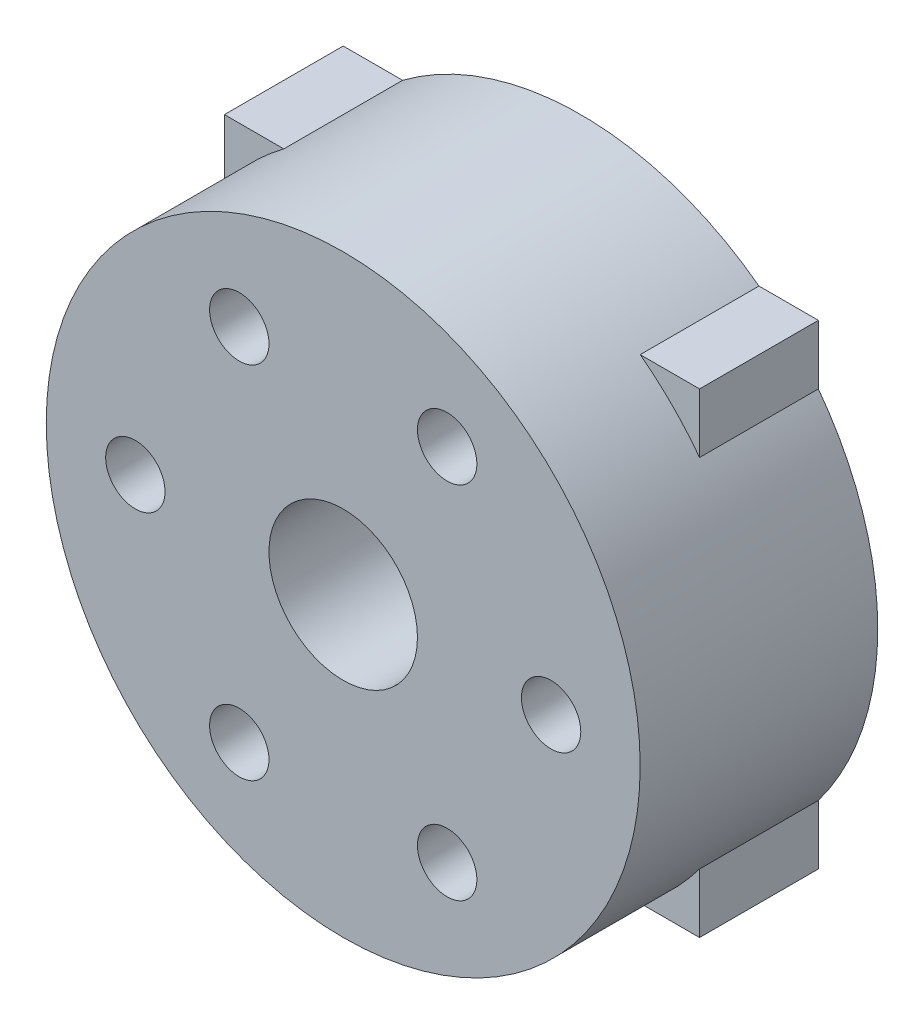
ISO-10303-21;
HEADER;
FILE_DESCRIPTION(('STEP AP214'),'2;1');
FILE_NAME('part.step','',(''),(''),'','','');
FILE_SCHEMA(('AUTOMOTIVE_DESIGN { 1 0 10303 214 1 1 1 1 }'));
ENDSEC;
DATA;
#1=APPLICATION_CONTEXT('core data for automotive mechanical design processes');
#2=APPLICATION_PROTOCOL_DEFINITION('international standard','automotive_design',2000,#1);
#3=PRODUCT_CONTEXT('',#1,'mechanical');
#4=PRODUCT('Part','Part','',(#3));
#5=PRODUCT_RELATED_PRODUCT_CATEGORY('part','',(#4));
#6=PRODUCT_DEFINITION_FORMATION('','',#4);
#7=PRODUCT_DEFINITION_CONTEXT('part definition',#1,'design');
#8=PRODUCT_DEFINITION('design','',#6,#7);
#9=PRODUCT_DEFINITION_SHAPE('','',#8);
#10=(LENGTH_UNIT() NAMED_UNIT(*) SI_UNIT(.MILLI.,.METRE.));
#11=(NAMED_UNIT(*) PLANE_ANGLE_UNIT() SI_UNIT($,.RADIAN.));
#12=(NAMED_UNIT(*) SI_UNIT($,.STERADIAN.) SOLID_ANGLE_UNIT());
#13=UNCERTAINTY_MEASURE_WITH_UNIT(LENGTH_MEASURE(1.E-05),#10,'distance_accuracy_value','');
#14=(GEOMETRIC_REPRESENTATION_CONTEXT(3) GLOBAL_UNCERTAINTY_ASSIGNED_CONTEXT((#13)) GLOBAL_UNIT_ASSIGNED_CONTEXT((#10,
#11,#12)) REPRESENTATION_CONTEXT('',''));
#15=CARTESIAN_POINT('',(0.,0.,0.));
#16=DIRECTION('',(0.,0.,1.));
#17=DIRECTION('',(1.,0.,0.));
#18=AXIS2_PLACEMENT_3D('',#15,#16,#17);
#19=CARTESIAN_POINT('',(0.,0.,20.));
#20=DIRECTION('',(0.,0.,1.));
#21=DIRECTION('',(1.,0.,0.));
#22=AXIS2_PLACEMENT_3D('',#19,#20,#21);
#23=PLANE('',#22);
#24=CARTESIAN_POINT('',(17.5,30.310889132455,20.));
#25=DIRECTION('',(0.,0.,-1.));
#26=DIRECTION('',(0.50000000000019,0.866025403784329,0.));
#27=AXIS2_PLACEMENT_3D('',#24,#25,#26);
#28=CIRCLE('',#27,5.);
#29=CARTESIAN_POINT('',(20.,34.641016151378,20.));
#30=VERTEX_POINT('',#29);
#31=EDGE_CURVE('E25',#30,#30,#28,.T.);
#32=ORIENTED_EDGE('',*,*,#31,.F.);
#33=EDGE_LOOP('',(#32));
#34=FACE_BOUND('',#33,.T.);
#35=ADVANCED_FACE('F16',(#34),#23,.T.);
#36=CARTESIAN_POINT('',(0.,0.,20.));
#37=DIRECTION('',(0.,0.,1.));
#38=DIRECTION('',(1.,0.,0.));
#39=AXIS2_PLACEMENT_3D('',#36,#37,#38);
#40=PLANE('',#39);
#41=CARTESIAN_POINT('',(-17.5,30.310889132455,20.));
#42=DIRECTION('',(0.,0.,-1.));
#43=DIRECTION('',(-0.50000000000019,0.866025403784329,0.));
#44=AXIS2_PLACEMENT_3D('',#41,#42,#43);
#45=CIRCLE('',#44,5.);
#46=CARTESIAN_POINT('',(-20.,34.641016151378,20.));
#47=VERTEX_POINT('',#46);
#48=EDGE_CURVE('E120',#47,#47,#45,.T.);
#49=ORIENTED_EDGE('',*,*,#48,.F.);
#50=EDGE_LOOP('',(#49));
#51=FACE_BOUND('',#50,.T.);
#52=ADVANCED_FACE('F477',(#51),#40,.T.);
#53=CARTESIAN_POINT('',(0.,0.,20.));
#54=DIRECTION('',(0.,0.,1.));
#55=DIRECTION('',(1.,0.,0.));
#56=AXIS2_PLACEMENT_3D('',#53,#54,#55);
#57=PLANE('',#56);
#58=CARTESIAN_POINT('',(-35.,0.,20.));
#59=DIRECTION('',(0.,0.,-1.));
#60=DIRECTION('',(-1.,0.,0.));
#61=AXIS2_PLACEMENT_3D('',#58,#59,#60);
#62=CIRCLE('',#61,5.);
#63=CARTESIAN_POINT('',(-40.,0.,20.));
#64=VERTEX_POINT('',#63);
#65=EDGE_CURVE('E116',#64,#64,#62,.T.);
#66=ORIENTED_EDGE('',*,*,#65,.F.);
#67=EDGE_LOOP('',(#66));
#68=FACE_BOUND('',#67,.T.);
#69=ADVANCED_FACE('F482',(#68),#57,.T.);
#70=CARTESIAN_POINT('',(0.,0.,20.));
#71=DIRECTION('',(0.,0.,1.));
#72=DIRECTION('',(1.,0.,0.));
#73=AXIS2_PLACEMENT_3D('',#70,#71,#72);
#74=PLANE('',#73);
#75=CARTESIAN_POINT('',(35.,0.,20.));
#76=DIRECTION('',(0.,0.,-1.));
#77=DIRECTION('',(1.,0.,0.));
#78=AXIS2_PLACEMENT_3D('',#75,#76,#77);
#79=CIRCLE('',#78,5.);
#80=CARTESIAN_POINT('',(40.,0.,20.));
#81=VERTEX_POINT('',#80);
#82=EDGE_CURVE('E133',#81,#81,#79,.T.);
#83=ORIENTED_EDGE('',*,*,#82,.F.);
#84=EDGE_LOOP('',(#83));
#85=FACE_BOUND('',#84,.T.);
#86=ADVANCED_FACE('F504',(#85),#74,.T.);
#87=CARTESIAN_POINT('',(0.,0.,20.));
#88=DIRECTION('',(0.,0.,1.));
#89=DIRECTION('',(1.,0.,0.));
#90=AXIS2_PLACEMENT_3D('',#87,#88,#89);
#91=PLANE('',#90);
#92=CARTESIAN_POINT('',(0.,0.,20.));
#93=DIRECTION('',(0.,0.,-1.));
#94=DIRECTION('',(1.,0.,0.));
#95=AXIS2_PLACEMENT_3D('',#92,#93,#94);
#96=CIRCLE('',#95,12.5);
#97=CARTESIAN_POINT('',(12.5,0.,20.));
#98=VERTEX_POINT('',#97);
#99=EDGE_CURVE('E138',#98,#98,#96,.T.);
#100=ORIENTED_EDGE('',*,*,#99,.F.);
#101=EDGE_LOOP('',(#100));
#102=FACE_BOUND('',#101,.T.);
#103=ADVANCED_FACE('F501',(#102),#91,.T.);
#104=CARTESIAN_POINT('',(0.,0.,20.));
#105=DIRECTION('',(0.,0.,1.));
#106=DIRECTION('',(1.,0.,0.));
#107=AXIS2_PLACEMENT_3D('',#104,#105,#106);
#108=PLANE('',#107);
#109=CARTESIAN_POINT('',(17.5,-30.31088913245,20.));
#110=DIRECTION('',(0.,0.,-1.));
#111=DIRECTION('',(0.50000000000019,-0.866025403784329,0.));
#112=AXIS2_PLACEMENT_3D('',#109,#110,#111);
#113=CIRCLE('',#112,5.);
#114=CARTESIAN_POINT('',(20.,-34.64101615137,20.));
#115=VERTEX_POINT('',#114);
#116=EDGE_CURVE('E146',#115,#115,#113,.T.);
#117=ORIENTED_EDGE('',*,*,#116,.F.);
#118=EDGE_LOOP('',(#117));
#119=FACE_BOUND('',#118,.T.);
#120=ADVANCED_FACE('F496',(#119),#108,.T.);
#121=CARTESIAN_POINT('',(0.,0.,20.));
#122=DIRECTION('',(0.,0.,1.));
#123=DIRECTION('',(1.,0.,0.));
#124=AXIS2_PLACEMENT_3D('',#121,#122,#123);
#125=PLANE('',#124);
#126=CARTESIAN_POINT('',(-17.5,-30.31088913245,20.));
#127=DIRECTION('',(0.,0.,-1.));
#128=DIRECTION('',(-0.50000000000019,-0.866025403784329,0.));
#129=AXIS2_PLACEMENT_3D('',#126,#127,#128);
#130=CIRCLE('',#129,5.);
#131=CARTESIAN_POINT('',(-20.,-34.64101615137,20.));
#132=VERTEX_POINT('',#131);
#133=EDGE_CURVE('E147',#132,#132,#130,.T.);
#134=ORIENTED_EDGE('',*,*,#133,.F.);
#135=EDGE_LOOP('',(#134));
#136=FACE_BOUND('',#135,.T.);
#137=ADVANCED_FACE('F488',(#136),#125,.T.);
#138=CARTESIAN_POINT('',(17.5,30.310889132455,0.));
#139=DIRECTION('',(0.,0.,-1.));
#140=DIRECTION('',(0.50000000000019,0.866025403784329,0.));
#141=AXIS2_PLACEMENT_3D('',#138,#139,#140);
#142=CYLINDRICAL_SURFACE('',#141,5.);
#143=ORIENTED_EDGE('',*,*,#31,.T.);
#144=DIRECTION('',(0.,0.,1.));
#145=VECTOR('',#144,1.);
#146=CARTESIAN_POINT('',(20.,34.641016151378,0.));
#147=LINE('',#146,#145);
#148=CARTESIAN_POINT('',(20.,34.641016151378,40.));
#149=VERTEX_POINT('',#148);
#150=EDGE_CURVE('E10',#30,#149,#147,.T.);
#151=ORIENTED_EDGE('',*,*,#150,.T.);
#152=CARTESIAN_POINT('',(17.5,30.310889132455,40.));
#153=DIRECTION('',(0.,0.,-1.));
#154=DIRECTION('',(0.50000000000019,0.866025403784329,0.));
#155=AXIS2_PLACEMENT_3D('',#152,#153,#154);
#156=CIRCLE('',#155,5.);
#157=EDGE_CURVE('E152',#149,#149,#156,.T.);
#158=ORIENTED_EDGE('',*,*,#157,.F.);
#159=ORIENTED_EDGE('',*,*,#150,.F.);
#160=EDGE_LOOP('',(#143,#151,#158,#159));
#161=FACE_BOUND('',#160,.T.);
#162=ADVANCED_FACE('F485',(#161),#142,.F.);
#163=CARTESIAN_POINT('',(-17.5,30.310889132455,0.));
#164=DIRECTION('',(0.,0.,-1.));
#165=DIRECTION('',(-0.50000000000019,0.866025403784329,0.));
#166=AXIS2_PLACEMENT_3D('',#163,#164,#165);
#167=CYLINDRICAL_SURFACE('',#166,5.);
#168=ORIENTED_EDGE('',*,*,#48,.T.);
#169=DIRECTION('',(0.,0.,1.));
#170=VECTOR('',#169,1.);
#171=CARTESIAN_POINT('',(-20.,34.641016151378,0.));
#172=LINE('',#171,#170);
#173=CARTESIAN_POINT('',(-20.,34.641016151378,40.));
#174=VERTEX_POINT('',#173);
#175=EDGE_CURVE('E126',#47,#174,#172,.T.);
#176=ORIENTED_EDGE('',*,*,#175,.T.);
#177=CARTESIAN_POINT('',(-17.5,30.310889132455,40.));
#178=DIRECTION('',(0.,0.,-1.));
#179=DIRECTION('',(-0.50000000000019,0.866025403784329,0.));
#180=AXIS2_PLACEMENT_3D('',#177,#178,#179);
#181=CIRCLE('',#180,5.);
#182=EDGE_CURVE('E158',#174,#174,#181,.T.);
#183=ORIENTED_EDGE('',*,*,#182,.F.);
#184=ORIENTED_EDGE('',*,*,#175,.F.);
#185=EDGE_LOOP('',(#168,#176,#183,#184));
#186=FACE_BOUND('',#185,.T.);
#187=ADVANCED_FACE('F487',(#186),#167,.F.);
#188=CARTESIAN_POINT('',(-35.,0.,0.));
#189=DIRECTION('',(0.,0.,-1.));
#190=DIRECTION('',(-1.,0.,0.));
#191=AXIS2_PLACEMENT_3D('',#188,#189,#190);
#192=CYLINDRICAL_SURFACE('',#191,5.);
#193=ORIENTED_EDGE('',*,*,#65,.T.);
#194=DIRECTION('',(0.,0.,1.));
#195=VECTOR('',#194,1.);
#196=CARTESIAN_POINT('',(-40.,0.,0.));
#197=LINE('',#196,#195);
#198=CARTESIAN_POINT('',(-40.,0.,40.));
#199=VERTEX_POINT('',#198);
#200=EDGE_CURVE('E113',#64,#199,#197,.T.);
#201=ORIENTED_EDGE('',*,*,#200,.T.);
#202=CARTESIAN_POINT('',(-35.,0.,40.));
#203=DIRECTION('',(0.,0.,-1.));
#204=DIRECTION('',(-1.,0.,0.));
#205=AXIS2_PLACEMENT_3D('',#202,#203,#204);
#206=CIRCLE('',#205,5.);
#207=EDGE_CURVE('E118',#199,#199,#206,.T.);
#208=ORIENTED_EDGE('',*,*,#207,.F.);
#209=ORIENTED_EDGE('',*,*,#200,.F.);
#210=EDGE_LOOP('',(#193,#201,#208,#209));
#211=FACE_BOUND('',#210,.T.);
#212=ADVANCED_FACE('F114',(#211),#192,.F.);
#213=CARTESIAN_POINT('',(35.,0.,0.));
#214=DIRECTION('',(0.,0.,-1.));
#215=DIRECTION('',(1.,0.,0.));
#216=AXIS2_PLACEMENT_3D('',#213,#214,#215);
#217=CYLINDRICAL_SURFACE('',#216,5.);
#218=ORIENTED_EDGE('',*,*,#82,.T.);
#219=DIRECTION('',(0.,0.,1.));
#220=VECTOR('',#219,1.);
#221=CARTESIAN_POINT('',(40.,0.,0.));
#222=LINE('',#221,#220);
#223=CARTESIAN_POINT('',(40.,0.,40.));
#224=VERTEX_POINT('',#223);
#225=EDGE_CURVE('E128',#81,#224,#222,.T.);
#226=ORIENTED_EDGE('',*,*,#225,.T.);
#227=CARTESIAN_POINT('',(35.,0.,40.));
#228=DIRECTION('',(0.,0.,-1.));
#229=DIRECTION('',(1.,0.,0.));
#230=AXIS2_PLACEMENT_3D('',#227,#228,#229);
#231=CIRCLE('',#230,5.);
#232=EDGE_CURVE('E164',#224,#224,#231,.T.);
#233=ORIENTED_EDGE('',*,*,#232,.F.);
#234=ORIENTED_EDGE('',*,*,#225,.F.);
#235=EDGE_LOOP('',(#218,#226,#233,#234));
#236=FACE_BOUND('',#235,.T.);
#237=ADVANCED_FACE('F564',(#236),#217,.F.);
#238=CARTESIAN_POINT('',(0.,0.,0.));
#239=DIRECTION('',(0.,0.,-1.));
#240=DIRECTION('',(1.,0.,0.));
#241=AXIS2_PLACEMENT_3D('',#238,#239,#240);
#242=CYLINDRICAL_SURFACE('',#241,12.5);
#243=ORIENTED_EDGE('',*,*,#99,.T.);
#244=DIRECTION('',(0.,0.,1.));
#245=VECTOR('',#244,1.);
#246=CARTESIAN_POINT('',(12.5,0.,0.));
#247=LINE('',#246,#245);
#248=CARTESIAN_POINT('',(12.5,0.,40.));
#249=VERTEX_POINT('',#248);
#250=EDGE_CURVE('E137',#98,#249,#247,.T.);
#251=ORIENTED_EDGE('',*,*,#250,.T.);
#252=CARTESIAN_POINT('',(0.,0.,40.));
#253=DIRECTION('',(0.,0.,-1.));
#254=DIRECTION('',(1.,0.,0.));
#255=AXIS2_PLACEMENT_3D('',#252,#253,#254);
#256=CIRCLE('',#255,12.5);
#257=EDGE_CURVE('E168',#249,#249,#256,.T.);
#258=ORIENTED_EDGE('',*,*,#257,.F.);
#259=ORIENTED_EDGE('',*,*,#250,.F.);
#260=EDGE_LOOP('',(#243,#251,#258,#259));
#261=FACE_BOUND('',#260,.T.);
#262=ADVANCED_FACE('F573',(#261),#242,.F.);
#263=CARTESIAN_POINT('',(17.5,-30.31088913245,0.));
#264=DIRECTION('',(0.,0.,-1.));
#265=DIRECTION('',(0.50000000000019,-0.866025403784329,0.));
#266=AXIS2_PLACEMENT_3D('',#263,#264,#265);
#267=CYLINDRICAL_SURFACE('',#266,5.);
#268=ORIENTED_EDGE('',*,*,#116,.T.);
#269=DIRECTION('',(0.,0.,1.));
#270=VECTOR('',#269,1.);
#271=CARTESIAN_POINT('',(20.,-34.64101615137,0.));
#272=LINE('',#271,#270);
#273=CARTESIAN_POINT('',(20.,-34.64101615137,40.));
#274=VERTEX_POINT('',#273);
#275=EDGE_CURVE('E142',#115,#274,#272,.T.);
#276=ORIENTED_EDGE('',*,*,#275,.T.);
#277=CARTESIAN_POINT('',(17.5,-30.31088913245,40.));
#278=DIRECTION('',(0.,0.,-1.));
#279=DIRECTION('',(0.50000000000019,-0.866025403784329,0.));
#280=AXIS2_PLACEMENT_3D('',#277,#278,#279);
#281=CIRCLE('',#280,5.);
#282=EDGE_CURVE('E175',#274,#274,#281,.T.);
#283=ORIENTED_EDGE('',*,*,#282,.F.);
#284=ORIENTED_EDGE('',*,*,#275,.F.);
#285=EDGE_LOOP('',(#268,#276,#283,#284));
#286=FACE_BOUND('',#285,.T.);
#287=ADVANCED_FACE('F471',(#286),#267,.F.);
#288=CARTESIAN_POINT('',(-17.5,-30.31088913245,0.));
#289=DIRECTION('',(0.,0.,-1.));
#290=DIRECTION('',(-0.50000000000019,-0.866025403784329,0.));
#291=AXIS2_PLACEMENT_3D('',#288,#289,#290);
#292=CYLINDRICAL_SURFACE('',#291,5.);
#293=ORIENTED_EDGE('',*,*,#133,.T.);
#294=DIRECTION('',(0.,0.,1.));
#295=VECTOR('',#294,1.);
#296=CARTESIAN_POINT('',(-20.,-34.64101615137,0.));
#297=LINE('',#296,#295);
#298=CARTESIAN_POINT('',(-20.,-34.64101615137,40.));
#299=VERTEX_POINT('',#298);
#300=EDGE_CURVE('E151',#132,#299,#297,.T.);
#301=ORIENTED_EDGE('',*,*,#300,.T.);
#302=CARTESIAN_POINT('',(-17.5,-30.31088913245,40.));
#303=DIRECTION('',(0.,0.,-1.));
#304=DIRECTION('',(-0.50000000000019,-0.866025403784329,0.));
#305=AXIS2_PLACEMENT_3D('',#302,#303,#304);
#306=CIRCLE('',#305,5.);
#307=EDGE_CURVE('E179',#299,#299,#306,.T.);
#308=ORIENTED_EDGE('',*,*,#307,.F.);
#309=ORIENTED_EDGE('',*,*,#300,.F.);
#310=EDGE_LOOP('',(#293,#301,#308,#309));
#311=FACE_BOUND('',#310,.T.);
#312=ADVANCED_FACE('F461',(#311),#292,.F.);
#313=CARTESIAN_POINT('',(0.,0.,40.));
#314=DIRECTION('',(0.,0.,1.));
#315=DIRECTION('',(1.,0.,0.));
#316=AXIS2_PLACEMENT_3D('',#313,#314,#315);
#317=PLANE('',#316);
#318=ORIENTED_EDGE('',*,*,#157,.T.);
#319=EDGE_LOOP('',(#318));
#320=FACE_BOUND('',#319,.T.);
#321=ORIENTED_EDGE('',*,*,#182,.T.);
#322=EDGE_LOOP('',(#321));
#323=FACE_BOUND('',#322,.T.);
#324=ORIENTED_EDGE('',*,*,#207,.T.);
#325=EDGE_LOOP('',(#324));
#326=FACE_BOUND('',#325,.T.);
#327=ORIENTED_EDGE('',*,*,#232,.T.);
#328=EDGE_LOOP('',(#327));
#329=FACE_BOUND('',#328,.T.);
#330=ORIENTED_EDGE('',*,*,#257,.T.);
#331=EDGE_LOOP('',(#330));
#332=FACE_BOUND('',#331,.T.);
#333=ORIENTED_EDGE('',*,*,#282,.T.);
#334=EDGE_LOOP('',(#333));
#335=FACE_BOUND('',#334,.T.);
#336=ORIENTED_EDGE('',*,*,#307,.T.);
#337=EDGE_LOOP('',(#336));
#338=FACE_BOUND('',#337,.T.);
#339=CARTESIAN_POINT('',(0.,0.,40.));
#340=DIRECTION('',(0.,0.,1.));
#341=DIRECTION('',(1.,0.,0.));
#342=AXIS2_PLACEMENT_3D('',#339,#340,#341);
#343=CIRCLE('',#342,50.);
#344=CARTESIAN_POINT('',(50.,0.,40.));
#345=VERTEX_POINT('',#344);
#346=EDGE_CURVE('E322',#345,#345,#343,.T.);
#347=ORIENTED_EDGE('',*,*,#346,.T.);
#348=EDGE_LOOP('',(#347));
#349=FACE_BOUND('',#348,.T.);
#350=ADVANCED_FACE('F459',(#320,#323,#326,#329,#332,#335,#338,#349),#317,.T.);
#351=CARTESIAN_POINT('',(40.,-40.,0.));
#352=DIRECTION('',(-1.,0.,0.));
#353=DIRECTION('',(0.,0.,1.));
#354=AXIS2_PLACEMENT_3D('',#351,#352,#353);
#355=PLANE('',#354);
#356=DIRECTION('',(0.,0.,1.));
#357=VECTOR('',#356,1.);
#358=CARTESIAN_POINT('',(40.,40.,0.));
#359=LINE('',#358,#357);
#360=CARTESIAN_POINT('',(40.,40.,0.));
#361=VERTEX_POINT('',#360);
#362=CARTESIAN_POINT('',(40.,40.,20.));
#363=VERTEX_POINT('',#362);
#364=EDGE_CURVE('E184',#361,#363,#359,.T.);
#365=ORIENTED_EDGE('',*,*,#364,.T.);
#366=DIRECTION('',(0.,1.,0.));
#367=VECTOR('',#366,1.);
#368=CARTESIAN_POINT('',(40.,-40.,20.));
#369=LINE('',#368,#367);
#370=CARTESIAN_POINT('',(40.,30.,20.));
#371=VERTEX_POINT('',#370);
#372=EDGE_CURVE('E183',#371,#363,#369,.T.);
#373=ORIENTED_EDGE('',*,*,#372,.F.);
#374=DIRECTION('',(0.,0.,1.));
#375=VECTOR('',#374,1.);
#376=CARTESIAN_POINT('',(40.,30.,0.));
#377=LINE('',#376,#375);
#378=CARTESIAN_POINT('',(40.,29.999999999999,0.));
#379=VERTEX_POINT('',#378);
#380=EDGE_CURVE('E304',#379,#371,#377,.T.);
#381=ORIENTED_EDGE('',*,*,#380,.F.);
#382=DIRECTION('',(0.,1.,0.));
#383=VECTOR('',#382,1.);
#384=CARTESIAN_POINT('',(40.,-40.,0.));
#385=LINE('',#384,#383);
#386=EDGE_CURVE('E216',#379,#361,#385,.T.);
#387=ORIENTED_EDGE('',*,*,#386,.T.);
#388=EDGE_LOOP('',(#365,#373,#381,#387));
#389=FACE_BOUND('',#388,.T.);
#390=ADVANCED_FACE('F457',(#389),#355,.F.);
#391=CARTESIAN_POINT('',(0.,0.,20.));
#392=DIRECTION('',(0.,0.,1.));
#393=DIRECTION('',(1.,0.,0.));
#394=AXIS2_PLACEMENT_3D('',#391,#392,#393);
#395=PLANE('',#394);
#396=CARTESIAN_POINT('',(0.,0.,20.));
#397=DIRECTION('',(0.,0.,1.));
#398=DIRECTION('',(1.,0.,0.));
#399=AXIS2_PLACEMENT_3D('',#396,#397,#398);
#400=CIRCLE('',#399,50.);
#401=CARTESIAN_POINT('',(30.,40.,20.));
#402=VERTEX_POINT('',#401);
#403=EDGE_CURVE('E297',#371,#402,#400,.T.);
#404=ORIENTED_EDGE('',*,*,#403,.F.);
#405=ORIENTED_EDGE('',*,*,#372,.T.);
#406=DIRECTION('',(-1.,0.,0.));
#407=VECTOR('',#406,1.);
#408=CARTESIAN_POINT('',(40.,40.,20.));
#409=LINE('',#408,#407);
#410=EDGE_CURVE('E188',#363,#402,#409,.T.);
#411=ORIENTED_EDGE('',*,*,#410,.T.);
#412=EDGE_LOOP('',(#404,#405,#411));
#413=FACE_BOUND('',#412,.T.);
#414=ADVANCED_FACE('F469',(#413),#395,.T.);
#415=CARTESIAN_POINT('',(40.,40.,0.));
#416=DIRECTION('',(0.,-1.,0.));
#417=DIRECTION('',(0.,0.,-1.));
#418=AXIS2_PLACEMENT_3D('',#415,#416,#417);
#419=PLANE('',#418);
#420=DIRECTION('',(0.,0.,1.));
#421=VECTOR('',#420,1.);
#422=CARTESIAN_POINT('',(30.,40.,0.));
#423=LINE('',#422,#421);
#424=CARTESIAN_POINT('',(30.000000000002,39.999999999999,0.));
#425=VERTEX_POINT('',#424);
#426=EDGE_CURVE('E293',#425,#402,#423,.T.);
#427=ORIENTED_EDGE('',*,*,#426,.T.);
#428=ORIENTED_EDGE('',*,*,#410,.F.);
#429=ORIENTED_EDGE('',*,*,#364,.F.);
#430=DIRECTION('',(-1.,0.,0.));
#431=VECTOR('',#430,1.);
#432=CARTESIAN_POINT('',(40.,40.,0.));
#433=LINE('',#432,#431);
#434=EDGE_CURVE('E220',#361,#425,#433,.T.);
#435=ORIENTED_EDGE('',*,*,#434,.T.);
#436=EDGE_LOOP('',(#427,#428,#429,#435));
#437=FACE_BOUND('',#436,.T.);
#438=ADVANCED_FACE('F454',(#437),#419,.F.);
#439=CARTESIAN_POINT('',(40.,40.,0.));
#440=DIRECTION('',(0.,-1.,0.));
#441=DIRECTION('',(0.,0.,-1.));
#442=AXIS2_PLACEMENT_3D('',#439,#440,#441);
#443=PLANE('',#442);
#444=DIRECTION('',(0.,0.,1.));
#445=VECTOR('',#444,1.);
#446=CARTESIAN_POINT('',(-40.,40.,0.));
#447=LINE('',#446,#445);
#448=CARTESIAN_POINT('',(-40.,40.,0.));
#449=VERTEX_POINT('',#448);
#450=CARTESIAN_POINT('',(-40.,40.,20.));
#451=VERTEX_POINT('',#450);
#452=EDGE_CURVE('E195',#449,#451,#447,.T.);
#453=ORIENTED_EDGE('',*,*,#452,.T.);
#454=DIRECTION('',(-1.,0.,0.));
#455=VECTOR('',#454,1.);
#456=CARTESIAN_POINT('',(40.,40.,20.));
#457=LINE('',#456,#455);
#458=CARTESIAN_POINT('',(-30.,40.,20.));
#459=VERTEX_POINT('',#458);
#460=EDGE_CURVE('E192',#459,#451,#457,.T.);
#461=ORIENTED_EDGE('',*,*,#460,.F.);
#462=DIRECTION('',(0.,0.,1.));
#463=VECTOR('',#462,1.);
#464=CARTESIAN_POINT('',(-30.,40.,0.));
#465=LINE('',#464,#463);
#466=CARTESIAN_POINT('',(-30.,40.,0.));
#467=VERTEX_POINT('',#466);
#468=EDGE_CURVE('E286',#467,#459,#465,.T.);
#469=ORIENTED_EDGE('',*,*,#468,.F.);
#470=DIRECTION('',(-1.,0.,0.));
#471=VECTOR('',#470,1.);
#472=CARTESIAN_POINT('',(40.,40.,0.));
#473=LINE('',#472,#471);
#474=EDGE_CURVE('E224',#467,#449,#473,.T.);
#475=ORIENTED_EDGE('',*,*,#474,.T.);
#476=EDGE_LOOP('',(#453,#461,#469,#475));
#477=FACE_BOUND('',#476,.T.);
#478=ADVANCED_FACE('F446',(#477),#443,.F.);
#479=CARTESIAN_POINT('',(0.,0.,20.));
#480=DIRECTION('',(0.,0.,1.));
#481=DIRECTION('',(1.,0.,0.));
#482=AXIS2_PLACEMENT_3D('',#479,#480,#481);
#483=PLANE('',#482);
#484=DIRECTION('',(0.,-1.,0.));
#485=VECTOR('',#484,1.);
#486=CARTESIAN_POINT('',(-40.,40.,20.));
#487=LINE('',#486,#485);
#488=CARTESIAN_POINT('',(-40.,30.,20.));
#489=VERTEX_POINT('',#488);
#490=EDGE_CURVE('E199',#451,#489,#487,.T.);
#491=ORIENTED_EDGE('',*,*,#490,.T.);
#492=CARTESIAN_POINT('',(0.,0.,20.));
#493=DIRECTION('',(0.,0.,1.));
#494=DIRECTION('',(1.,0.,0.));
#495=AXIS2_PLACEMENT_3D('',#492,#493,#494);
#496=CIRCLE('',#495,50.);
#497=EDGE_CURVE('E282',#459,#489,#496,.T.);
#498=ORIENTED_EDGE('',*,*,#497,.F.);
#499=ORIENTED_EDGE('',*,*,#460,.T.);
#500=EDGE_LOOP('',(#491,#498,#499));
#501=FACE_BOUND('',#500,.T.);
#502=ADVANCED_FACE('F637',(#501),#483,.T.);
#503=CARTESIAN_POINT('',(-40.,40.,0.));
#504=DIRECTION('',(1.,0.,0.));
#505=DIRECTION('',(0.,1.,0.));
#506=AXIS2_PLACEMENT_3D('',#503,#504,#505);
#507=PLANE('',#506);
#508=DIRECTION('',(0.,0.,1.));
#509=VECTOR('',#508,1.);
#510=CARTESIAN_POINT('',(-40.,30.,0.));
#511=LINE('',#510,#509);
#512=CARTESIAN_POINT('',(-39.99999999999,30.000000000002,0.));
#513=VERTEX_POINT('',#512);
#514=EDGE_CURVE('E278',#513,#489,#511,.T.);
#515=ORIENTED_EDGE('',*,*,#514,.T.);
#516=ORIENTED_EDGE('',*,*,#490,.F.);
#517=ORIENTED_EDGE('',*,*,#452,.F.);
#518=DIRECTION('',(0.,-1.,0.));
#519=VECTOR('',#518,1.);
#520=CARTESIAN_POINT('',(-40.,40.,0.));
#521=LINE('',#520,#519);
#522=EDGE_CURVE('E228',#449,#513,#521,.T.);
#523=ORIENTED_EDGE('',*,*,#522,.T.);
#524=EDGE_LOOP('',(#515,#516,#517,#523));
#525=FACE_BOUND('',#524,.T.);
#526=ADVANCED_FACE('F443',(#525),#507,.F.);
#527=CARTESIAN_POINT('',(-40.,40.,0.));
#528=DIRECTION('',(1.,0.,0.));
#529=DIRECTION('',(0.,1.,0.));
#530=AXIS2_PLACEMENT_3D('',#527,#528,#529);
#531=PLANE('',#530);
#532=DIRECTION('',(0.,0.,1.));
#533=VECTOR('',#532,1.);
#534=CARTESIAN_POINT('',(-40.,-40.,0.));
#535=LINE('',#534,#533);
#536=CARTESIAN_POINT('',(-40.,-40.,0.));
#537=VERTEX_POINT('',#536);
#538=CARTESIAN_POINT('',(-40.,-40.,20.));
#539=VERTEX_POINT('',#538);
#540=EDGE_CURVE('E200',#537,#539,#535,.T.);
#541=ORIENTED_EDGE('',*,*,#540,.T.);
#542=DIRECTION('',(0.,-1.,0.));
#543=VECTOR('',#542,1.);
#544=CARTESIAN_POINT('',(-40.,40.,20.));
#545=LINE('',#544,#543);
#546=CARTESIAN_POINT('',(-40.,-30.,20.));
#547=VERTEX_POINT('',#546);
#548=EDGE_CURVE('E196',#547,#539,#545,.T.);
#549=ORIENTED_EDGE('',*,*,#548,.F.);
#550=DIRECTION('',(0.,0.,1.));
#551=VECTOR('',#550,1.);
#552=CARTESIAN_POINT('',(-40.,-30.,0.));
#553=LINE('',#552,#551);
#554=CARTESIAN_POINT('',(-39.99999999999,-30.,0.));
#555=VERTEX_POINT('',#554);
#556=EDGE_CURVE('E269',#555,#547,#553,.T.);
#557=ORIENTED_EDGE('',*,*,#556,.F.);
#558=DIRECTION('',(0.,-1.,0.));
#559=VECTOR('',#558,1.);
#560=CARTESIAN_POINT('',(-40.,40.,0.));
#561=LINE('',#560,#559);
#562=EDGE_CURVE('E232',#555,#537,#561,.T.);
#563=ORIENTED_EDGE('',*,*,#562,.T.);
#564=EDGE_LOOP('',(#541,#549,#557,#563));
#565=FACE_BOUND('',#564,.T.);
#566=ADVANCED_FACE('F436',(#565),#531,.F.);
#567=CARTESIAN_POINT('',(0.,0.,20.));
#568=DIRECTION('',(0.,0.,1.));
#569=DIRECTION('',(1.,0.,0.));
#570=AXIS2_PLACEMENT_3D('',#567,#568,#569);
#571=PLANE('',#570);
#572=ORIENTED_EDGE('',*,*,#548,.T.);
#573=DIRECTION('',(1.,0.,0.));
#574=VECTOR('',#573,1.);
#575=CARTESIAN_POINT('',(-40.,-40.,20.));
#576=LINE('',#575,#574);
#577=CARTESIAN_POINT('',(-30.,-40.,20.));
#578=VERTEX_POINT('',#577);
#579=EDGE_CURVE('E204',#539,#578,#576,.T.);
#580=ORIENTED_EDGE('',*,*,#579,.T.);
#581=CARTESIAN_POINT('',(0.,0.,20.));
#582=DIRECTION('',(0.,0.,1.));
#583=DIRECTION('',(1.,0.,0.));
#584=AXIS2_PLACEMENT_3D('',#581,#582,#583);
#585=CIRCLE('',#584,50.);
#586=EDGE_CURVE('E273',#547,#578,#585,.T.);
#587=ORIENTED_EDGE('',*,*,#586,.F.);
#588=EDGE_LOOP('',(#572,#580,#587));
#589=FACE_BOUND('',#588,.T.);
#590=ADVANCED_FACE('F660',(#589),#571,.T.);
#591=CARTESIAN_POINT('',(-40.,-40.,0.));
#592=DIRECTION('',(0.,1.,0.));
#593=DIRECTION('',(1.,0.,0.));
#594=AXIS2_PLACEMENT_3D('',#591,#592,#593);
#595=PLANE('',#594);
#596=DIRECTION('',(0.,0.,1.));
#597=VECTOR('',#596,1.);
#598=CARTESIAN_POINT('',(-30.,-40.,0.));
#599=LINE('',#598,#597);
#600=CARTESIAN_POINT('',(-30.,-40.,0.));
#601=VERTEX_POINT('',#600);
#602=EDGE_CURVE('E314',#601,#578,#599,.T.);
#603=ORIENTED_EDGE('',*,*,#602,.T.);
#604=ORIENTED_EDGE('',*,*,#579,.F.);
#605=ORIENTED_EDGE('',*,*,#540,.F.);
#606=DIRECTION('',(1.,0.,0.));
#607=VECTOR('',#606,1.);
#608=CARTESIAN_POINT('',(-40.,-40.,0.));
#609=LINE('',#608,#607);
#610=EDGE_CURVE('E236',#537,#601,#609,.T.);
#611=ORIENTED_EDGE('',*,*,#610,.T.);
#612=EDGE_LOOP('',(#603,#604,#605,#611));
#613=FACE_BOUND('',#612,.T.);
#614=ADVANCED_FACE('F433',(#613),#595,.F.);
#615=CARTESIAN_POINT('',(-40.,-40.,0.));
#616=DIRECTION('',(0.,1.,0.));
#617=DIRECTION('',(1.,0.,0.));
#618=AXIS2_PLACEMENT_3D('',#615,#616,#617);
#619=PLANE('',#618);
#620=DIRECTION('',(0.,0.,1.));
#621=VECTOR('',#620,1.);
#622=CARTESIAN_POINT('',(40.,-40.,0.));
#623=LINE('',#622,#621);
#624=CARTESIAN_POINT('',(40.,-40.,0.));
#625=VERTEX_POINT('',#624);
#626=CARTESIAN_POINT('',(40.,-40.,20.));
#627=VERTEX_POINT('',#626);
#628=EDGE_CURVE('E208',#625,#627,#623,.T.);
#629=ORIENTED_EDGE('',*,*,#628,.T.);
#630=DIRECTION('',(1.,0.,0.));
#631=VECTOR('',#630,1.);
#632=CARTESIAN_POINT('',(-40.,-40.,20.));
#633=LINE('',#632,#631);
#634=CARTESIAN_POINT('',(30.,-40.,20.));
#635=VERTEX_POINT('',#634);
#636=EDGE_CURVE('E205',#635,#627,#633,.T.);
#637=ORIENTED_EDGE('',*,*,#636,.F.);
#638=DIRECTION('',(0.,0.,1.));
#639=VECTOR('',#638,1.);
#640=CARTESIAN_POINT('',(30.,-40.,0.));
#641=LINE('',#640,#639);
#642=CARTESIAN_POINT('',(30.000000000002,-39.99999999999,0.));
#643=VERTEX_POINT('',#642);
#644=EDGE_CURVE('E261',#643,#635,#641,.T.);
#645=ORIENTED_EDGE('',*,*,#644,.F.);
#646=DIRECTION('',(1.,0.,0.));
#647=VECTOR('',#646,1.);
#648=CARTESIAN_POINT('',(-40.,-40.,0.));
#649=LINE('',#648,#647);
#650=EDGE_CURVE('E242',#643,#625,#649,.T.);
#651=ORIENTED_EDGE('',*,*,#650,.T.);
#652=EDGE_LOOP('',(#629,#637,#645,#651));
#653=FACE_BOUND('',#652,.T.);
#654=ADVANCED_FACE('F428',(#653),#619,.F.);
#655=CARTESIAN_POINT('',(0.,0.,20.));
#656=DIRECTION('',(0.,0.,1.));
#657=DIRECTION('',(1.,0.,0.));
#658=AXIS2_PLACEMENT_3D('',#655,#656,#657);
#659=PLANE('',#658);
#660=CARTESIAN_POINT('',(0.,0.,20.));
#661=DIRECTION('',(0.,0.,1.));
#662=DIRECTION('',(1.,0.,0.));
#663=AXIS2_PLACEMENT_3D('',#660,#661,#662);
#664=CIRCLE('',#663,50.);
#665=CARTESIAN_POINT('',(40.,-30.,20.));
#666=VERTEX_POINT('',#665);
#667=EDGE_CURVE('E257',#635,#666,#664,.T.);
#668=ORIENTED_EDGE('',*,*,#667,.F.);
#669=ORIENTED_EDGE('',*,*,#636,.T.);
#670=DIRECTION('',(0.,1.,0.));
#671=VECTOR('',#670,1.);
#672=CARTESIAN_POINT('',(40.,-40.,20.));
#673=LINE('',#672,#671);
#674=EDGE_CURVE('E212',#627,#666,#673,.T.);
#675=ORIENTED_EDGE('',*,*,#674,.T.);
#676=EDGE_LOOP('',(#668,#669,#675));
#677=FACE_BOUND('',#676,.T.);
#678=ADVANCED_FACE('F424',(#677),#659,.T.);
#679=CARTESIAN_POINT('',(40.,-40.,0.));
#680=DIRECTION('',(-1.,0.,0.));
#681=DIRECTION('',(0.,0.,1.));
#682=AXIS2_PLACEMENT_3D('',#679,#680,#681);
#683=PLANE('',#682);
#684=DIRECTION('',(0.,0.,1.));
#685=VECTOR('',#684,1.);
#686=CARTESIAN_POINT('',(40.,-30.,0.));
#687=LINE('',#686,#685);
#688=CARTESIAN_POINT('',(40.,-29.99999999999,0.));
#689=VERTEX_POINT('',#688);
#690=EDGE_CURVE('E253',#689,#666,#687,.T.);
#691=ORIENTED_EDGE('',*,*,#690,.T.);
#692=ORIENTED_EDGE('',*,*,#674,.F.);
#693=ORIENTED_EDGE('',*,*,#628,.F.);
#694=DIRECTION('',(0.,1.,0.));
#695=VECTOR('',#694,1.);
#696=CARTESIAN_POINT('',(40.,-40.,0.));
#697=LINE('',#696,#695);
#698=EDGE_CURVE('E249',#625,#689,#697,.T.);
#699=ORIENTED_EDGE('',*,*,#698,.T.);
#700=EDGE_LOOP('',(#691,#692,#693,#699));
#701=FACE_BOUND('',#700,.T.);
#702=ADVANCED_FACE('F425',(#701),#683,.F.);
#703=CARTESIAN_POINT('',(0.,0.,0.));
#704=DIRECTION('',(0.,0.,1.));
#705=DIRECTION('',(1.,0.,0.));
#706=AXIS2_PLACEMENT_3D('',#703,#704,#705);
#707=PLANE('',#706);
#708=CARTESIAN_POINT('',(0.,0.,0.));
#709=DIRECTION('',(0.,0.,1.));
#710=DIRECTION('',(1.,0.,0.));
#711=AXIS2_PLACEMENT_3D('',#708,#709,#710);
#712=CIRCLE('',#711,50.);
#713=CARTESIAN_POINT('',(50.,0.,0.));
#714=VERTEX_POINT('',#713);
#715=EDGE_CURVE('E318',#714,#379,#712,.T.);
#716=ORIENTED_EDGE('',*,*,#715,.F.);
#717=CARTESIAN_POINT('',(0.,0.,0.));
#718=DIRECTION('',(0.,0.,1.));
#719=DIRECTION('',(1.,0.,0.));
#720=AXIS2_PLACEMENT_3D('',#717,#718,#719);
#721=CIRCLE('',#720,50.);
#722=EDGE_CURVE('E330',#689,#714,#721,.T.);
#723=ORIENTED_EDGE('',*,*,#722,.F.);
#724=ORIENTED_EDGE('',*,*,#698,.F.);
#725=ORIENTED_EDGE('',*,*,#650,.F.);
#726=CARTESIAN_POINT('',(0.,0.,0.));
#727=DIRECTION('',(0.,0.,1.));
#728=DIRECTION('',(1.,0.,0.));
#729=AXIS2_PLACEMENT_3D('',#726,#727,#728);
#730=CIRCLE('',#729,50.);
#731=EDGE_CURVE('E268',#601,#643,#730,.T.);
#732=ORIENTED_EDGE('',*,*,#731,.F.);
#733=ORIENTED_EDGE('',*,*,#610,.F.);
#734=ORIENTED_EDGE('',*,*,#562,.F.);
#735=CARTESIAN_POINT('',(0.,0.,0.));
#736=DIRECTION('',(0.,0.,1.));
#737=DIRECTION('',(1.,0.,0.));
#738=AXIS2_PLACEMENT_3D('',#735,#736,#737);
#739=CIRCLE('',#738,50.);
#740=EDGE_CURVE('E274',#513,#555,#739,.T.);
#741=ORIENTED_EDGE('',*,*,#740,.F.);
#742=ORIENTED_EDGE('',*,*,#522,.F.);
#743=ORIENTED_EDGE('',*,*,#474,.F.);
#744=CARTESIAN_POINT('',(0.,0.,0.));
#745=DIRECTION('',(0.,0.,1.));
#746=DIRECTION('',(1.,0.,0.));
#747=AXIS2_PLACEMENT_3D('',#744,#745,#746);
#748=CIRCLE('',#747,50.);
#749=EDGE_CURVE('E289',#425,#467,#748,.T.);
#750=ORIENTED_EDGE('',*,*,#749,.F.);
#751=ORIENTED_EDGE('',*,*,#434,.F.);
#752=ORIENTED_EDGE('',*,*,#386,.F.);
#753=EDGE_LOOP('',(#716,#723,#724,#725,#732,#733,#734,#741,#742,#743,#750,#751,#752));
#754=FACE_BOUND('',#753,.T.);
#755=ADVANCED_FACE('F356',(#754),#707,.F.);
#756=CARTESIAN_POINT('',(0.,0.,0.));
#757=DIRECTION('',(0.,0.,1.));
#758=DIRECTION('',(1.,0.,0.));
#759=AXIS2_PLACEMENT_3D('',#756,#757,#758);
#760=CYLINDRICAL_SURFACE('',#759,50.);
#761=ORIENTED_EDGE('',*,*,#722,.T.);
#762=DIRECTION('',(0.,0.,1.));
#763=VECTOR('',#762,1.);
#764=CARTESIAN_POINT('',(50.,0.,0.));
#765=LINE('',#764,#763);
#766=EDGE_CURVE('E326',#714,#345,#765,.T.);
#767=ORIENTED_EDGE('',*,*,#766,.T.);
#768=ORIENTED_EDGE('',*,*,#346,.F.);
#769=ORIENTED_EDGE('',*,*,#766,.F.);
#770=ORIENTED_EDGE('',*,*,#715,.T.);
#771=ORIENTED_EDGE('',*,*,#380,.T.);
#772=ORIENTED_EDGE('',*,*,#403,.T.);
#773=ORIENTED_EDGE('',*,*,#426,.F.);
#774=ORIENTED_EDGE('',*,*,#749,.T.);
#775=ORIENTED_EDGE('',*,*,#468,.T.);
#776=ORIENTED_EDGE('',*,*,#497,.T.);
#777=ORIENTED_EDGE('',*,*,#514,.F.);
#778=ORIENTED_EDGE('',*,*,#740,.T.);
#779=ORIENTED_EDGE('',*,*,#556,.T.);
#780=ORIENTED_EDGE('',*,*,#586,.T.);
#781=ORIENTED_EDGE('',*,*,#602,.F.);
#782=ORIENTED_EDGE('',*,*,#731,.T.);
#783=ORIENTED_EDGE('',*,*,#644,.T.);
#784=ORIENTED_EDGE('',*,*,#667,.T.);
#785=ORIENTED_EDGE('',*,*,#690,.F.);
#786=EDGE_LOOP('',(#761,#767,#768,#769,#770,#771,#772,#773,#774,#775,#776,#777,#778,#779,#780,
#781,#782,#783,#784,#785));
#787=FACE_BOUND('',#786,.T.);
#788=ADVANCED_FACE('F346',(#787),#760,.T.);
#789=CLOSED_SHELL('',(#35,#52,#69,#86,#103,#120,#137,#162,#187,#212,#237,#262,#287,#312,#350,
#390,#414,#438,#478,#502,#526,#566,#590,#614,#654,#678,#702,#755,#788));
#790=MANIFOLD_SOLID_BREP('B1',#789);
#791=ADVANCED_BREP_SHAPE_REPRESENTATION('',(#18,#790),#14);
#792=SHAPE_DEFINITION_REPRESENTATION(#9,#791);
ENDSEC;
END-ISO-10303-21;
